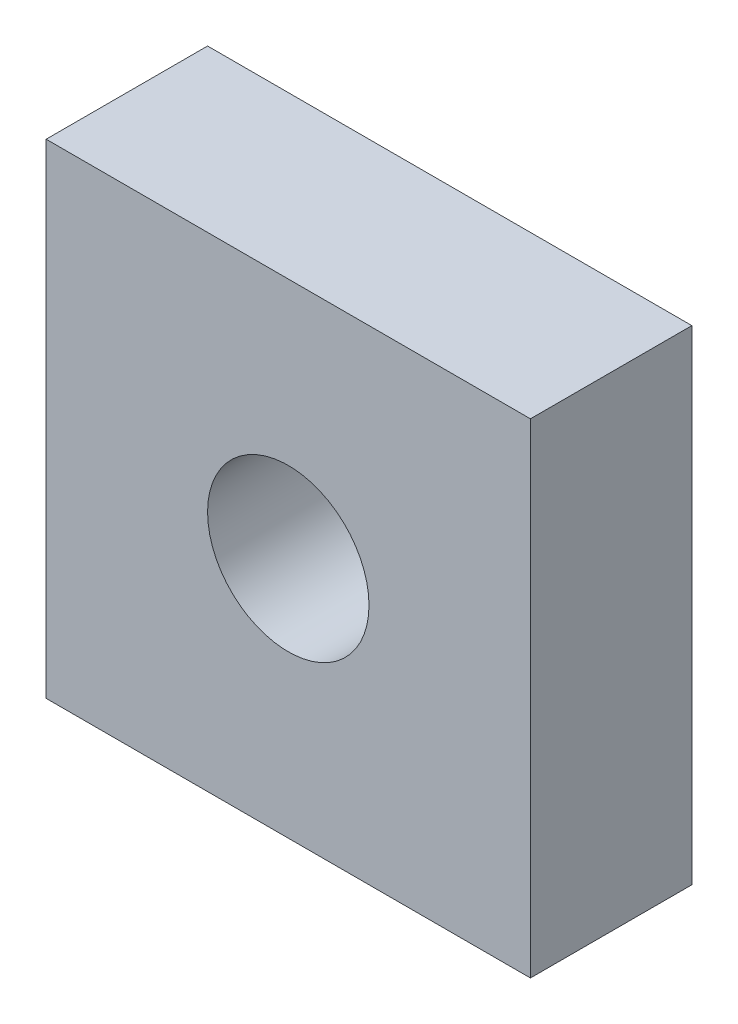
ISO-10303-21;
HEADER;
FILE_DESCRIPTION(('STEP AP214'),'2;1');
FILE_NAME('part.step','',(''),(''),'','','');
FILE_SCHEMA(('AUTOMOTIVE_DESIGN { 1 0 10303 214 1 1 1 1 }'));
ENDSEC;
DATA;
#1=APPLICATION_CONTEXT('core data for automotive mechanical design processes');
#2=APPLICATION_PROTOCOL_DEFINITION('international standard','automotive_design',2000,#1);
#3=PRODUCT_CONTEXT('',#1,'mechanical');
#4=PRODUCT('Part','Part','',(#3));
#5=PRODUCT_RELATED_PRODUCT_CATEGORY('part','',(#4));
#6=PRODUCT_DEFINITION_FORMATION('','',#4);
#7=PRODUCT_DEFINITION_CONTEXT('part definition',#1,'design');
#8=PRODUCT_DEFINITION('design','',#6,#7);
#9=PRODUCT_DEFINITION_SHAPE('','',#8);
#10=(LENGTH_UNIT() NAMED_UNIT(*) SI_UNIT(.MILLI.,.METRE.));
#11=(NAMED_UNIT(*) PLANE_ANGLE_UNIT() SI_UNIT($,.RADIAN.));
#12=(NAMED_UNIT(*) SI_UNIT($,.STERADIAN.) SOLID_ANGLE_UNIT());
#13=UNCERTAINTY_MEASURE_WITH_UNIT(LENGTH_MEASURE(1.E-05),#10,'distance_accuracy_value','');
#14=(GEOMETRIC_REPRESENTATION_CONTEXT(3) GLOBAL_UNCERTAINTY_ASSIGNED_CONTEXT((#13)) GLOBAL_UNIT_ASSIGNED_CONTEXT((#10,
#11,#12)) REPRESENTATION_CONTEXT('',''));
#15=CARTESIAN_POINT('',(0.,0.,0.));
#16=DIRECTION('',(0.,0.,1.));
#17=DIRECTION('',(1.,0.,0.));
#18=AXIS2_PLACEMENT_3D('',#15,#16,#17);
#19=CARTESIAN_POINT('',(15.,-15.,10.));
#20=DIRECTION('',(-1.,0.,0.));
#21=DIRECTION('',(0.,0.,1.));
#22=AXIS2_PLACEMENT_3D('',#19,#20,#21);
#23=PLANE('',#22);
#24=DIRECTION('',(0.,1.,0.));
#25=VECTOR('',#24,1.);
#26=CARTESIAN_POINT('',(15.,-15.,0.));
#27=LINE('',#26,#25);
#28=CARTESIAN_POINT('',(15.,-15.,0.));
#29=VERTEX_POINT('',#28);
#30=CARTESIAN_POINT('',(15.,15.,0.));
#31=VERTEX_POINT('',#30);
#32=EDGE_CURVE('E96',#29,#31,#27,.T.);
#33=ORIENTED_EDGE('',*,*,#32,.T.);
#34=DIRECTION('',(0.,0.,-1.));
#35=VECTOR('',#34,1.);
#36=CARTESIAN_POINT('',(15.,15.,10.));
#37=LINE('',#36,#35);
#38=CARTESIAN_POINT('',(15.,15.,10.));
#39=VERTEX_POINT('',#38);
#40=EDGE_CURVE('E11',#39,#31,#37,.T.);
#41=ORIENTED_EDGE('',*,*,#40,.F.);
#42=DIRECTION('',(0.,1.,0.));
#43=VECTOR('',#42,1.);
#44=CARTESIAN_POINT('',(15.,-15.,10.));
#45=LINE('',#44,#43);
#46=CARTESIAN_POINT('',(15.,-15.,10.));
#47=VERTEX_POINT('',#46);
#48=EDGE_CURVE('E84',#47,#39,#45,.T.);
#49=ORIENTED_EDGE('',*,*,#48,.F.);
#50=DIRECTION('',(0.,0.,-1.));
#51=VECTOR('',#50,1.);
#52=CARTESIAN_POINT('',(15.,-15.,10.));
#53=LINE('',#52,#51);
#54=EDGE_CURVE('E92',#47,#29,#53,.T.);
#55=ORIENTED_EDGE('',*,*,#54,.T.);
#56=EDGE_LOOP('',(#33,#41,#49,#55));
#57=FACE_BOUND('',#56,.T.);
#58=ADVANCED_FACE('F33',(#57),#23,.F.);
#59=CARTESIAN_POINT('',(-15.,15.,10.));
#60=DIRECTION('',(0.,-1.,0.));
#61=DIRECTION('',(0.,0.,-1.));
#62=AXIS2_PLACEMENT_3D('',#59,#60,#61);
#63=PLANE('',#62);
#64=DIRECTION('',(-1.,0.,0.));
#65=VECTOR('',#64,1.);
#66=CARTESIAN_POINT('',(-15.,15.,0.));
#67=LINE('',#66,#65);
#68=CARTESIAN_POINT('',(-15.,15.,0.));
#69=VERTEX_POINT('',#68);
#70=EDGE_CURVE('E88',#31,#69,#67,.T.);
#71=ORIENTED_EDGE('',*,*,#70,.T.);
#72=DIRECTION('',(0.,0.,-1.));
#73=VECTOR('',#72,1.);
#74=CARTESIAN_POINT('',(-15.,15.,10.));
#75=LINE('',#74,#73);
#76=CARTESIAN_POINT('',(-15.,15.,10.));
#77=VERTEX_POINT('',#76);
#78=EDGE_CURVE('E41',#77,#69,#75,.T.);
#79=ORIENTED_EDGE('',*,*,#78,.F.);
#80=DIRECTION('',(-1.,0.,0.));
#81=VECTOR('',#80,1.);
#82=CARTESIAN_POINT('',(-15.,15.,10.));
#83=LINE('',#82,#81);
#84=EDGE_CURVE('E79',#39,#77,#83,.T.);
#85=ORIENTED_EDGE('',*,*,#84,.F.);
#86=ORIENTED_EDGE('',*,*,#40,.T.);
#87=EDGE_LOOP('',(#71,#79,#85,#86));
#88=FACE_BOUND('',#87,.T.);
#89=ADVANCED_FACE('F87',(#88),#63,.F.);
#90=CARTESIAN_POINT('',(-15.,-15.,10.));
#91=DIRECTION('',(1.,0.,0.));
#92=DIRECTION('',(0.,0.,-1.));
#93=AXIS2_PLACEMENT_3D('',#90,#91,#92);
#94=PLANE('',#93);
#95=DIRECTION('',(0.,-1.,0.));
#96=VECTOR('',#95,1.);
#97=CARTESIAN_POINT('',(-15.,-15.,0.));
#98=LINE('',#97,#96);
#99=CARTESIAN_POINT('',(-15.,-15.,0.));
#100=VERTEX_POINT('',#99);
#101=EDGE_CURVE('E66',#69,#100,#98,.T.);
#102=ORIENTED_EDGE('',*,*,#101,.T.);
#103=DIRECTION('',(0.,0.,-1.));
#104=VECTOR('',#103,1.);
#105=CARTESIAN_POINT('',(-15.,-15.,10.));
#106=LINE('',#105,#104);
#107=CARTESIAN_POINT('',(-15.,-15.,10.));
#108=VERTEX_POINT('',#107);
#109=EDGE_CURVE('E89',#108,#100,#106,.T.);
#110=ORIENTED_EDGE('',*,*,#109,.F.);
#111=DIRECTION('',(0.,-1.,0.));
#112=VECTOR('',#111,1.);
#113=CARTESIAN_POINT('',(-15.,-15.,10.));
#114=LINE('',#113,#112);
#115=EDGE_CURVE('E82',#77,#108,#114,.T.);
#116=ORIENTED_EDGE('',*,*,#115,.F.);
#117=ORIENTED_EDGE('',*,*,#78,.T.);
#118=EDGE_LOOP('',(#102,#110,#116,#117));
#119=FACE_BOUND('',#118,.T.);
#120=ADVANCED_FACE('F90',(#119),#94,.F.);
#121=CARTESIAN_POINT('',(-15.,-15.,10.));
#122=DIRECTION('',(0.,1.,0.));
#123=DIRECTION('',(0.,0.,1.));
#124=AXIS2_PLACEMENT_3D('',#121,#122,#123);
#125=PLANE('',#124);
#126=DIRECTION('',(1.,0.,0.));
#127=VECTOR('',#126,1.);
#128=CARTESIAN_POINT('',(-15.,-15.,0.));
#129=LINE('',#128,#127);
#130=EDGE_CURVE('E72',#100,#29,#129,.T.);
#131=ORIENTED_EDGE('',*,*,#130,.T.);
#132=ORIENTED_EDGE('',*,*,#54,.F.);
#133=DIRECTION('',(1.,0.,0.));
#134=VECTOR('',#133,1.);
#135=CARTESIAN_POINT('',(-15.,-15.,10.));
#136=LINE('',#135,#134);
#137=EDGE_CURVE('E49',#108,#47,#136,.T.);
#138=ORIENTED_EDGE('',*,*,#137,.F.);
#139=ORIENTED_EDGE('',*,*,#109,.T.);
#140=EDGE_LOOP('',(#131,#132,#138,#139));
#141=FACE_BOUND('',#140,.T.);
#142=ADVANCED_FACE('F104',(#141),#125,.F.);
#143=CARTESIAN_POINT('',(0.,0.,10.));
#144=DIRECTION('',(0.,0.,-1.));
#145=DIRECTION('',(-1.,0.,0.));
#146=AXIS2_PLACEMENT_3D('',#143,#144,#145);
#147=PLANE('',#146);
#148=CARTESIAN_POINT('',(0.,0.,10.));
#149=DIRECTION('',(0.,0.,1.));
#150=DIRECTION('',(1.,0.,0.));
#151=AXIS2_PLACEMENT_3D('',#148,#149,#150);
#152=CIRCLE('',#151,5.);
#153=CARTESIAN_POINT('',(5.,0.,10.));
#154=VERTEX_POINT('',#153);
#155=EDGE_CURVE('E110',#154,#154,#152,.T.);
#156=ORIENTED_EDGE('',*,*,#155,.F.);
#157=EDGE_LOOP('',(#156));
#158=FACE_BOUND('',#157,.T.);
#159=ORIENTED_EDGE('',*,*,#48,.T.);
#160=ORIENTED_EDGE('',*,*,#84,.T.);
#161=ORIENTED_EDGE('',*,*,#115,.T.);
#162=ORIENTED_EDGE('',*,*,#137,.T.);
#163=EDGE_LOOP('',(#159,#160,#161,#162));
#164=FACE_BOUND('',#163,.T.);
#165=ADVANCED_FACE('F80',(#158,#164),#147,.F.);
#166=CARTESIAN_POINT('',(0.,0.,0.));
#167=DIRECTION('',(0.,0.,-1.));
#168=DIRECTION('',(-1.,0.,0.));
#169=AXIS2_PLACEMENT_3D('',#166,#167,#168);
#170=PLANE('',#169);
#171=CARTESIAN_POINT('',(0.,0.,0.));
#172=DIRECTION('',(0.,0.,1.));
#173=DIRECTION('',(1.,0.,0.));
#174=AXIS2_PLACEMENT_3D('',#171,#172,#173);
#175=CIRCLE('',#174,5.);
#176=CARTESIAN_POINT('',(5.,0.,0.));
#177=VERTEX_POINT('',#176);
#178=EDGE_CURVE('E99',#177,#177,#175,.T.);
#179=ORIENTED_EDGE('',*,*,#178,.T.);
#180=EDGE_LOOP('',(#179));
#181=FACE_BOUND('',#180,.T.);
#182=ORIENTED_EDGE('',*,*,#32,.F.);
#183=ORIENTED_EDGE('',*,*,#130,.F.);
#184=ORIENTED_EDGE('',*,*,#101,.F.);
#185=ORIENTED_EDGE('',*,*,#70,.F.);
#186=EDGE_LOOP('',(#182,#183,#184,#185));
#187=FACE_BOUND('',#186,.T.);
#188=ADVANCED_FACE('F107',(#181,#187),#170,.T.);
#189=CARTESIAN_POINT('',(0.,0.,0.));
#190=DIRECTION('',(0.,0.,1.));
#191=DIRECTION('',(1.,0.,0.));
#192=AXIS2_PLACEMENT_3D('',#189,#190,#191);
#193=CYLINDRICAL_SURFACE('',#192,5.);
#194=ORIENTED_EDGE('',*,*,#178,.F.);
#195=EDGE_LOOP('',(#194));
#196=FACE_BOUND('',#195,.T.);
#197=ORIENTED_EDGE('',*,*,#155,.T.);
#198=EDGE_LOOP('',(#197));
#199=FACE_BOUND('',#198,.T.);
#200=ADVANCED_FACE('F117',(#196,#199),#193,.F.);
#201=CLOSED_SHELL('',(#58,#89,#120,#142,#165,#188,#200));
#202=MANIFOLD_SOLID_BREP('B2',#201);
#203=ADVANCED_BREP_SHAPE_REPRESENTATION('',(#18,#202),#14);
#204=SHAPE_DEFINITION_REPRESENTATION(#9,#203);
ENDSEC;
END-ISO-10303-21;
